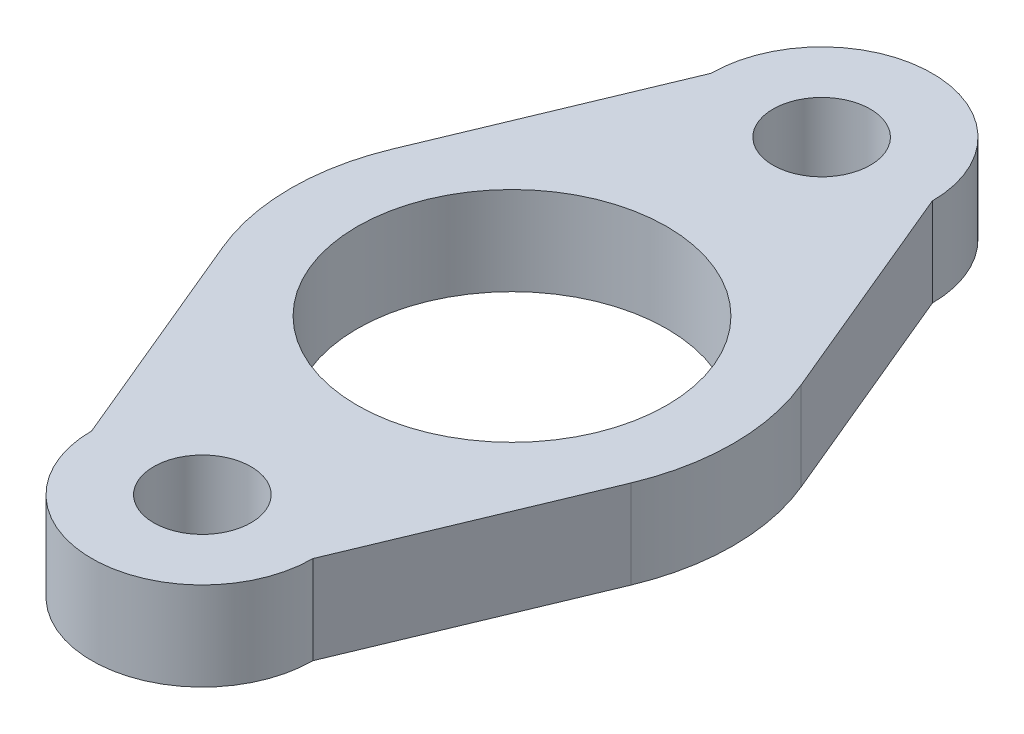
ISO-10303-21;
HEADER;
FILE_DESCRIPTION(('STEP AP214'),'2;1');
FILE_NAME('part.step','',(''),(''),'','','');
FILE_SCHEMA(('AUTOMOTIVE_DESIGN { 1 0 10303 214 1 1 1 1 }'));
ENDSEC;
DATA;
#1=APPLICATION_CONTEXT('core data for automotive mechanical design processes');
#2=APPLICATION_PROTOCOL_DEFINITION('international standard','automotive_design',2000,#1);
#3=PRODUCT_CONTEXT('',#1,'mechanical');
#4=PRODUCT('Part','Part','',(#3));
#5=PRODUCT_RELATED_PRODUCT_CATEGORY('part','',(#4));
#6=PRODUCT_DEFINITION_FORMATION('','',#4);
#7=PRODUCT_DEFINITION_CONTEXT('part definition',#1,'design');
#8=PRODUCT_DEFINITION('design','',#6,#7);
#9=PRODUCT_DEFINITION_SHAPE('','',#8);
#10=(LENGTH_UNIT() NAMED_UNIT(*) SI_UNIT(.MILLI.,.METRE.));
#11=(NAMED_UNIT(*) PLANE_ANGLE_UNIT() SI_UNIT($,.RADIAN.));
#12=(NAMED_UNIT(*) SI_UNIT($,.STERADIAN.) SOLID_ANGLE_UNIT());
#13=UNCERTAINTY_MEASURE_WITH_UNIT(LENGTH_MEASURE(1.E-05),#10,'distance_accuracy_value','');
#14=(GEOMETRIC_REPRESENTATION_CONTEXT(3) GLOBAL_UNCERTAINTY_ASSIGNED_CONTEXT((#13)) GLOBAL_UNIT_ASSIGNED_CONTEXT((#10,
#11,#12)) REPRESENTATION_CONTEXT('',''));
#15=CARTESIAN_POINT('',(0.,0.,0.));
#16=DIRECTION('',(0.,0.,1.));
#17=DIRECTION('',(1.,0.,0.));
#18=AXIS2_PLACEMENT_3D('',#15,#16,#17);
#19=CARTESIAN_POINT('',(-23.0769230769231,10.,-9.61538461538462));
#20=DIRECTION('',(0.923076923076923,0.,0.384615384615385));
#21=DIRECTION('',(0.384615384615385,0.,-0.923076923076923));
#22=AXIS2_PLACEMENT_3D('',#19,#20,#21);
#23=PLANE('',#22);
#24=DIRECTION('',(-0.384615384615385,0.,0.923076923076923));
#25=VECTOR('',#24,1.);
#26=CARTESIAN_POINT('',(-23.0769230769231,0.,-9.61538461538462));
#27=LINE('',#26,#25);
#28=CARTESIAN_POINT('',(-12.5,0.,-35.));
#29=VERTEX_POINT('',#28);
#30=CARTESIAN_POINT('',(-23.0769230769231,0.,-9.61538461538462));
#31=VERTEX_POINT('',#30);
#32=EDGE_CURVE('E157',#29,#31,#27,.T.);
#33=ORIENTED_EDGE('',*,*,#32,.T.);
#34=DIRECTION('',(0.,-1.,0.));
#35=VECTOR('',#34,1.);
#36=CARTESIAN_POINT('',(-23.0769230769231,10.,-9.61538461538462));
#37=LINE('',#36,#35);
#38=CARTESIAN_POINT('',(-23.0769230769231,10.,-9.61538461538462));
#39=VERTEX_POINT('',#38);
#40=EDGE_CURVE('E11',#39,#31,#37,.T.);
#41=ORIENTED_EDGE('',*,*,#40,.F.);
#42=DIRECTION('',(-0.384615384615385,0.,0.923076923076923));
#43=VECTOR('',#42,1.);
#44=CARTESIAN_POINT('',(-23.0769230769231,10.,-9.61538461538462));
#45=LINE('',#44,#43);
#46=CARTESIAN_POINT('',(-12.5,10.,-35.));
#47=VERTEX_POINT('',#46);
#48=EDGE_CURVE('E229',#47,#39,#45,.T.);
#49=ORIENTED_EDGE('',*,*,#48,.F.);
#50=DIRECTION('',(0.,-1.,0.));
#51=VECTOR('',#50,1.);
#52=CARTESIAN_POINT('',(-12.5,10.,-35.));
#53=LINE('',#52,#51);
#54=EDGE_CURVE('E148',#47,#29,#53,.T.);
#55=ORIENTED_EDGE('',*,*,#54,.T.);
#56=EDGE_LOOP('',(#33,#41,#49,#55));
#57=FACE_BOUND('',#56,.T.);
#58=ADVANCED_FACE('F43',(#57),#23,.F.);
#59=CARTESIAN_POINT('',(0.,10.,0.));
#60=DIRECTION('',(0.,-1.,0.));
#61=DIRECTION('',(0.,0.,-1.));
#62=AXIS2_PLACEMENT_3D('',#59,#60,#61);
#63=CYLINDRICAL_SURFACE('',#62,25.);
#64=CARTESIAN_POINT('',(0.,0.,0.));
#65=DIRECTION('',(0.,1.,0.));
#66=DIRECTION('',(0.,0.,1.));
#67=AXIS2_PLACEMENT_3D('',#64,#65,#66);
#68=CIRCLE('',#67,25.);
#69=CARTESIAN_POINT('',(-23.0769230769231,0.,9.61538461538463));
#70=VERTEX_POINT('',#69);
#71=EDGE_CURVE('E161',#31,#70,#68,.T.);
#72=ORIENTED_EDGE('',*,*,#71,.T.);
#73=DIRECTION('',(0.,-1.,0.));
#74=VECTOR('',#73,1.);
#75=CARTESIAN_POINT('',(-23.0769230769231,10.,9.61538461538463));
#76=LINE('',#75,#74);
#77=CARTESIAN_POINT('',(-23.0769230769231,10.,9.61538461538463));
#78=VERTEX_POINT('',#77);
#79=EDGE_CURVE('E53',#78,#70,#76,.T.);
#80=ORIENTED_EDGE('',*,*,#79,.F.);
#81=CARTESIAN_POINT('',(0.,10.,0.));
#82=DIRECTION('',(0.,1.,0.));
#83=DIRECTION('',(0.,0.,1.));
#84=AXIS2_PLACEMENT_3D('',#81,#82,#83);
#85=CIRCLE('',#84,25.);
#86=EDGE_CURVE('E100',#39,#78,#85,.T.);
#87=ORIENTED_EDGE('',*,*,#86,.F.);
#88=ORIENTED_EDGE('',*,*,#40,.T.);
#89=EDGE_LOOP('',(#72,#80,#87,#88));
#90=FACE_BOUND('',#89,.T.);
#91=ADVANCED_FACE('F206',(#90),#63,.T.);
#92=CARTESIAN_POINT('',(-23.0769230769231,10.,9.61538461538463));
#93=DIRECTION('',(-0.923076923076923,0.,0.384615384615385));
#94=DIRECTION('',(0.384615384615385,0.,0.923076923076923));
#95=AXIS2_PLACEMENT_3D('',#92,#93,#94);
#96=PLANE('',#95);
#97=DIRECTION('',(-0.384615384615385,0.,-0.923076923076923));
#98=VECTOR('',#97,1.);
#99=CARTESIAN_POINT('',(-23.0769230769231,0.,9.61538461538463));
#100=LINE('',#99,#98);
#101=CARTESIAN_POINT('',(-12.5,0.,35.));
#102=VERTEX_POINT('',#101);
#103=EDGE_CURVE('E165',#102,#70,#100,.T.);
#104=ORIENTED_EDGE('',*,*,#103,.F.);
#105=DIRECTION('',(0.,-1.,0.));
#106=VECTOR('',#105,1.);
#107=CARTESIAN_POINT('',(-12.5,10.,35.));
#108=LINE('',#107,#106);
#109=CARTESIAN_POINT('',(-12.5,10.,35.));
#110=VERTEX_POINT('',#109);
#111=EDGE_CURVE('E197',#110,#102,#108,.T.);
#112=ORIENTED_EDGE('',*,*,#111,.F.);
#113=DIRECTION('',(-0.384615384615385,0.,-0.923076923076923));
#114=VECTOR('',#113,1.);
#115=CARTESIAN_POINT('',(-23.0769230769231,10.,9.61538461538463));
#116=LINE('',#115,#114);
#117=EDGE_CURVE('E205',#110,#78,#116,.T.);
#118=ORIENTED_EDGE('',*,*,#117,.T.);
#119=ORIENTED_EDGE('',*,*,#79,.T.);
#120=EDGE_LOOP('',(#104,#112,#118,#119));
#121=FACE_BOUND('',#120,.T.);
#122=ADVANCED_FACE('F203',(#121),#96,.T.);
#123=CARTESIAN_POINT('',(0.,10.,35.));
#124=DIRECTION('',(0.,-1.,0.));
#125=DIRECTION('',(0.,0.,-1.));
#126=AXIS2_PLACEMENT_3D('',#123,#124,#125);
#127=CYLINDRICAL_SURFACE('',#126,12.5);
#128=CARTESIAN_POINT('',(0.,0.,35.));
#129=DIRECTION('',(0.,1.,0.));
#130=DIRECTION('',(0.,0.,1.));
#131=AXIS2_PLACEMENT_3D('',#128,#129,#130);
#132=CIRCLE('',#131,12.5);
#133=CARTESIAN_POINT('',(12.5,0.,35.));
#134=VERTEX_POINT('',#133);
#135=EDGE_CURVE('E169',#102,#134,#132,.T.);
#136=ORIENTED_EDGE('',*,*,#135,.T.);
#137=DIRECTION('',(0.,-1.,0.));
#138=VECTOR('',#137,1.);
#139=CARTESIAN_POINT('',(12.5,10.,35.));
#140=LINE('',#139,#138);
#141=CARTESIAN_POINT('',(12.5,10.,35.));
#142=VERTEX_POINT('',#141);
#143=EDGE_CURVE('E193',#142,#134,#140,.T.);
#144=ORIENTED_EDGE('',*,*,#143,.F.);
#145=CARTESIAN_POINT('',(0.,10.,35.));
#146=DIRECTION('',(0.,1.,0.));
#147=DIRECTION('',(0.,0.,1.));
#148=AXIS2_PLACEMENT_3D('',#145,#146,#147);
#149=CIRCLE('',#148,12.5);
#150=EDGE_CURVE('E221',#110,#142,#149,.T.);
#151=ORIENTED_EDGE('',*,*,#150,.F.);
#152=ORIENTED_EDGE('',*,*,#111,.T.);
#153=EDGE_LOOP('',(#136,#144,#151,#152));
#154=FACE_BOUND('',#153,.T.);
#155=ADVANCED_FACE('F216',(#154),#127,.T.);
#156=CARTESIAN_POINT('',(23.0769230769231,10.,9.61538461538463));
#157=DIRECTION('',(-0.923076923076923,0.,-0.384615384615385));
#158=DIRECTION('',(-0.384615384615385,0.,0.923076923076923));
#159=AXIS2_PLACEMENT_3D('',#156,#157,#158);
#160=PLANE('',#159);
#161=DIRECTION('',(0.384615384615385,0.,-0.923076923076923));
#162=VECTOR('',#161,1.);
#163=CARTESIAN_POINT('',(23.0769230769231,0.,9.61538461538463));
#164=LINE('',#163,#162);
#165=CARTESIAN_POINT('',(23.0769230769231,0.,9.61538461538463));
#166=VERTEX_POINT('',#165);
#167=EDGE_CURVE('E172',#134,#166,#164,.T.);
#168=ORIENTED_EDGE('',*,*,#167,.T.);
#169=DIRECTION('',(0.,-1.,0.));
#170=VECTOR('',#169,1.);
#171=CARTESIAN_POINT('',(23.0769230769231,10.,9.61538461538463));
#172=LINE('',#171,#170);
#173=CARTESIAN_POINT('',(23.0769230769231,10.,9.61538461538463));
#174=VERTEX_POINT('',#173);
#175=EDGE_CURVE('E135',#174,#166,#172,.T.);
#176=ORIENTED_EDGE('',*,*,#175,.F.);
#177=DIRECTION('',(0.384615384615385,0.,-0.923076923076923));
#178=VECTOR('',#177,1.);
#179=CARTESIAN_POINT('',(23.0769230769231,10.,9.61538461538463));
#180=LINE('',#179,#178);
#181=EDGE_CURVE('E120',#142,#174,#180,.T.);
#182=ORIENTED_EDGE('',*,*,#181,.F.);
#183=ORIENTED_EDGE('',*,*,#143,.T.);
#184=EDGE_LOOP('',(#168,#176,#182,#183));
#185=FACE_BOUND('',#184,.T.);
#186=ADVANCED_FACE('F219',(#185),#160,.F.);
#187=CARTESIAN_POINT('',(0.,10.,0.));
#188=DIRECTION('',(0.,-1.,0.));
#189=DIRECTION('',(0.,0.,-1.));
#190=AXIS2_PLACEMENT_3D('',#187,#188,#189);
#191=CYLINDRICAL_SURFACE('',#190,25.);
#192=CARTESIAN_POINT('',(0.,0.,0.));
#193=DIRECTION('',(0.,1.,0.));
#194=DIRECTION('',(0.,0.,1.));
#195=AXIS2_PLACEMENT_3D('',#192,#193,#194);
#196=CIRCLE('',#195,25.);
#197=CARTESIAN_POINT('',(23.0769230769231,0.,-9.61538461538462));
#198=VERTEX_POINT('',#197);
#199=EDGE_CURVE('E130',#166,#198,#196,.T.);
#200=ORIENTED_EDGE('',*,*,#199,.T.);
#201=DIRECTION('',(0.,-1.,0.));
#202=VECTOR('',#201,1.);
#203=CARTESIAN_POINT('',(23.0769230769231,10.,-9.61538461538462));
#204=LINE('',#203,#202);
#205=CARTESIAN_POINT('',(23.0769230769231,10.,-9.61538461538462));
#206=VERTEX_POINT('',#205);
#207=EDGE_CURVE('E127',#206,#198,#204,.T.);
#208=ORIENTED_EDGE('',*,*,#207,.F.);
#209=CARTESIAN_POINT('',(0.,10.,0.));
#210=DIRECTION('',(0.,1.,0.));
#211=DIRECTION('',(0.,0.,1.));
#212=AXIS2_PLACEMENT_3D('',#209,#210,#211);
#213=CIRCLE('',#212,25.);
#214=EDGE_CURVE('E113',#174,#206,#213,.T.);
#215=ORIENTED_EDGE('',*,*,#214,.F.);
#216=ORIENTED_EDGE('',*,*,#175,.T.);
#217=EDGE_LOOP('',(#200,#208,#215,#216));
#218=FACE_BOUND('',#217,.T.);
#219=ADVANCED_FACE('F128',(#218),#191,.T.);
#220=CARTESIAN_POINT('',(23.0769230769231,10.,-9.61538461538462));
#221=DIRECTION('',(0.923076923076923,0.,-0.384615384615385));
#222=DIRECTION('',(-0.384615384615385,0.,-0.923076923076923));
#223=AXIS2_PLACEMENT_3D('',#220,#221,#222);
#224=PLANE('',#223);
#225=DIRECTION('',(0.384615384615385,0.,0.923076923076923));
#226=VECTOR('',#225,1.);
#227=CARTESIAN_POINT('',(23.0769230769231,0.,-9.61538461538462));
#228=LINE('',#227,#226);
#229=CARTESIAN_POINT('',(12.5,0.,-35.));
#230=VERTEX_POINT('',#229);
#231=EDGE_CURVE('E177',#230,#198,#228,.T.);
#232=ORIENTED_EDGE('',*,*,#231,.F.);
#233=DIRECTION('',(0.,-1.,0.));
#234=VECTOR('',#233,1.);
#235=CARTESIAN_POINT('',(12.5,10.,-35.));
#236=LINE('',#235,#234);
#237=CARTESIAN_POINT('',(12.5,10.,-35.));
#238=VERTEX_POINT('',#237);
#239=EDGE_CURVE('E89',#238,#230,#236,.T.);
#240=ORIENTED_EDGE('',*,*,#239,.F.);
#241=DIRECTION('',(0.384615384615385,0.,0.923076923076923));
#242=VECTOR('',#241,1.);
#243=CARTESIAN_POINT('',(23.0769230769231,10.,-9.61538461538462));
#244=LINE('',#243,#242);
#245=EDGE_CURVE('E118',#238,#206,#244,.T.);
#246=ORIENTED_EDGE('',*,*,#245,.T.);
#247=ORIENTED_EDGE('',*,*,#207,.T.);
#248=EDGE_LOOP('',(#232,#240,#246,#247));
#249=FACE_BOUND('',#248,.T.);
#250=ADVANCED_FACE('F137',(#249),#224,.T.);
#251=CARTESIAN_POINT('',(0.,10.,-35.));
#252=DIRECTION('',(0.,-1.,0.));
#253=DIRECTION('',(0.,0.,-1.));
#254=AXIS2_PLACEMENT_3D('',#251,#252,#253);
#255=CYLINDRICAL_SURFACE('',#254,12.5);
#256=CARTESIAN_POINT('',(0.,0.,-35.));
#257=DIRECTION('',(0.,1.,0.));
#258=DIRECTION('',(0.,0.,1.));
#259=AXIS2_PLACEMENT_3D('',#256,#257,#258);
#260=CIRCLE('',#259,12.5);
#261=EDGE_CURVE('E92',#230,#29,#260,.T.);
#262=ORIENTED_EDGE('',*,*,#261,.T.);
#263=ORIENTED_EDGE('',*,*,#54,.F.);
#264=CARTESIAN_POINT('',(0.,10.,-35.));
#265=DIRECTION('',(0.,1.,0.));
#266=DIRECTION('',(0.,0.,1.));
#267=AXIS2_PLACEMENT_3D('',#264,#265,#266);
#268=CIRCLE('',#267,12.5);
#269=EDGE_CURVE('E61',#238,#47,#268,.T.);
#270=ORIENTED_EDGE('',*,*,#269,.F.);
#271=ORIENTED_EDGE('',*,*,#239,.T.);
#272=EDGE_LOOP('',(#262,#263,#270,#271));
#273=FACE_BOUND('',#272,.T.);
#274=ADVANCED_FACE('F251',(#273),#255,.T.);
#275=CARTESIAN_POINT('',(0.,10.,35.));
#276=DIRECTION('',(0.,-1.,0.));
#277=DIRECTION('',(0.,0.,-1.));
#278=AXIS2_PLACEMENT_3D('',#275,#276,#277);
#279=CYLINDRICAL_SURFACE('',#278,5.5);
#280=CARTESIAN_POINT('',(0.,10.,35.));
#281=DIRECTION('',(0.,1.,0.));
#282=DIRECTION('',(0.,0.,1.));
#283=AXIS2_PLACEMENT_3D('',#280,#281,#282);
#284=CIRCLE('',#283,5.5);
#285=CARTESIAN_POINT('',(0.,10.,40.5));
#286=VERTEX_POINT('',#285);
#287=EDGE_CURVE('E232',#286,#286,#284,.T.);
#288=ORIENTED_EDGE('',*,*,#287,.T.);
#289=EDGE_LOOP('',(#288));
#290=FACE_BOUND('',#289,.T.);
#291=CARTESIAN_POINT('',(0.,0.,35.));
#292=DIRECTION('',(0.,1.,0.));
#293=DIRECTION('',(0.,0.,1.));
#294=AXIS2_PLACEMENT_3D('',#291,#292,#293);
#295=CIRCLE('',#294,5.5);
#296=CARTESIAN_POINT('',(0.,0.,40.5));
#297=VERTEX_POINT('',#296);
#298=EDGE_CURVE('E153',#297,#297,#295,.T.);
#299=ORIENTED_EDGE('',*,*,#298,.F.);
#300=EDGE_LOOP('',(#299));
#301=FACE_BOUND('',#300,.T.);
#302=ADVANCED_FACE('F248',(#290,#301),#279,.F.);
#303=CARTESIAN_POINT('',(0.,10.,-35.));
#304=DIRECTION('',(0.,-1.,0.));
#305=DIRECTION('',(0.,0.,-1.));
#306=AXIS2_PLACEMENT_3D('',#303,#304,#305);
#307=CYLINDRICAL_SURFACE('',#306,5.5);
#308=CARTESIAN_POINT('',(0.,10.,-35.));
#309=DIRECTION('',(0.,1.,0.));
#310=DIRECTION('',(0.,0.,1.));
#311=AXIS2_PLACEMENT_3D('',#308,#309,#310);
#312=CIRCLE('',#311,5.5);
#313=CARTESIAN_POINT('',(0.,10.,-29.5));
#314=VERTEX_POINT('',#313);
#315=EDGE_CURVE('E186',#314,#314,#312,.T.);
#316=ORIENTED_EDGE('',*,*,#315,.T.);
#317=EDGE_LOOP('',(#316));
#318=FACE_BOUND('',#317,.T.);
#319=CARTESIAN_POINT('',(0.,0.,-35.));
#320=DIRECTION('',(0.,1.,0.));
#321=DIRECTION('',(0.,0.,1.));
#322=AXIS2_PLACEMENT_3D('',#319,#320,#321);
#323=CIRCLE('',#322,5.5);
#324=CARTESIAN_POINT('',(0.,0.,-29.5));
#325=VERTEX_POINT('',#324);
#326=EDGE_CURVE('E149',#325,#325,#323,.T.);
#327=ORIENTED_EDGE('',*,*,#326,.F.);
#328=EDGE_LOOP('',(#327));
#329=FACE_BOUND('',#328,.T.);
#330=ADVANCED_FACE('F45',(#318,#329),#307,.F.);
#331=CARTESIAN_POINT('',(0.,10.,0.));
#332=DIRECTION('',(0.,-1.,0.));
#333=DIRECTION('',(0.,0.,-1.));
#334=AXIS2_PLACEMENT_3D('',#331,#332,#333);
#335=CYLINDRICAL_SURFACE('',#334,17.5);
#336=CARTESIAN_POINT('',(0.,10.,0.));
#337=DIRECTION('',(0.,1.,0.));
#338=DIRECTION('',(0.,0.,1.));
#339=AXIS2_PLACEMENT_3D('',#336,#337,#338);
#340=CIRCLE('',#339,17.5);
#341=CARTESIAN_POINT('',(0.,10.,17.5));
#342=VERTEX_POINT('',#341);
#343=EDGE_CURVE('E141',#342,#342,#340,.T.);
#344=ORIENTED_EDGE('',*,*,#343,.T.);
#345=EDGE_LOOP('',(#344));
#346=FACE_BOUND('',#345,.T.);
#347=CARTESIAN_POINT('',(0.,0.,0.));
#348=DIRECTION('',(0.,1.,0.));
#349=DIRECTION('',(0.,0.,1.));
#350=AXIS2_PLACEMENT_3D('',#347,#348,#349);
#351=CIRCLE('',#350,17.5);
#352=CARTESIAN_POINT('',(0.,0.,17.5));
#353=VERTEX_POINT('',#352);
#354=EDGE_CURVE('E182',#353,#353,#351,.T.);
#355=ORIENTED_EDGE('',*,*,#354,.F.);
#356=EDGE_LOOP('',(#355));
#357=FACE_BOUND('',#356,.T.);
#358=ADVANCED_FACE('F244',(#346,#357),#335,.F.);
#359=CARTESIAN_POINT('',(0.,10.,0.));
#360=DIRECTION('',(0.,1.,0.));
#361=DIRECTION('',(0.,0.,1.));
#362=AXIS2_PLACEMENT_3D('',#359,#360,#361);
#363=PLANE('',#362);
#364=ORIENTED_EDGE('',*,*,#315,.F.);
#365=EDGE_LOOP('',(#364));
#366=FACE_BOUND('',#365,.T.);
#367=ORIENTED_EDGE('',*,*,#287,.F.);
#368=EDGE_LOOP('',(#367));
#369=FACE_BOUND('',#368,.T.);
#370=ORIENTED_EDGE('',*,*,#48,.T.);
#371=ORIENTED_EDGE('',*,*,#86,.T.);
#372=ORIENTED_EDGE('',*,*,#117,.F.);
#373=ORIENTED_EDGE('',*,*,#150,.T.);
#374=ORIENTED_EDGE('',*,*,#181,.T.);
#375=ORIENTED_EDGE('',*,*,#214,.T.);
#376=ORIENTED_EDGE('',*,*,#245,.F.);
#377=ORIENTED_EDGE('',*,*,#269,.T.);
#378=EDGE_LOOP('',(#370,#371,#372,#373,#374,#375,#376,#377));
#379=FACE_BOUND('',#378,.T.);
#380=ORIENTED_EDGE('',*,*,#343,.F.);
#381=EDGE_LOOP('',(#380));
#382=FACE_BOUND('',#381,.T.);
#383=ADVANCED_FACE('F115',(#366,#369,#379,#382),#363,.T.);
#384=CARTESIAN_POINT('',(0.,0.,0.));
#385=DIRECTION('',(0.,1.,0.));
#386=DIRECTION('',(0.,0.,1.));
#387=AXIS2_PLACEMENT_3D('',#384,#385,#386);
#388=PLANE('',#387);
#389=ORIENTED_EDGE('',*,*,#326,.T.);
#390=EDGE_LOOP('',(#389));
#391=FACE_BOUND('',#390,.T.);
#392=ORIENTED_EDGE('',*,*,#298,.T.);
#393=EDGE_LOOP('',(#392));
#394=FACE_BOUND('',#393,.T.);
#395=ORIENTED_EDGE('',*,*,#32,.F.);
#396=ORIENTED_EDGE('',*,*,#261,.F.);
#397=ORIENTED_EDGE('',*,*,#231,.T.);
#398=ORIENTED_EDGE('',*,*,#199,.F.);
#399=ORIENTED_EDGE('',*,*,#167,.F.);
#400=ORIENTED_EDGE('',*,*,#135,.F.);
#401=ORIENTED_EDGE('',*,*,#103,.T.);
#402=ORIENTED_EDGE('',*,*,#71,.F.);
#403=EDGE_LOOP('',(#395,#396,#397,#398,#399,#400,#401,#402));
#404=FACE_BOUND('',#403,.T.);
#405=ORIENTED_EDGE('',*,*,#354,.T.);
#406=EDGE_LOOP('',(#405));
#407=FACE_BOUND('',#406,.T.);
#408=ADVANCED_FACE('F211',(#391,#394,#404,#407),#388,.F.);
#409=CLOSED_SHELL('',(#58,#91,#122,#155,#186,#219,#250,#274,#302,#330,#358,#383,#408));
#410=MANIFOLD_SOLID_BREP('B2',#409);
#411=ADVANCED_BREP_SHAPE_REPRESENTATION('',(#18,#410),#14);
#412=SHAPE_DEFINITION_REPRESENTATION(#9,#411);
ENDSEC;
END-ISO-10303-21;
